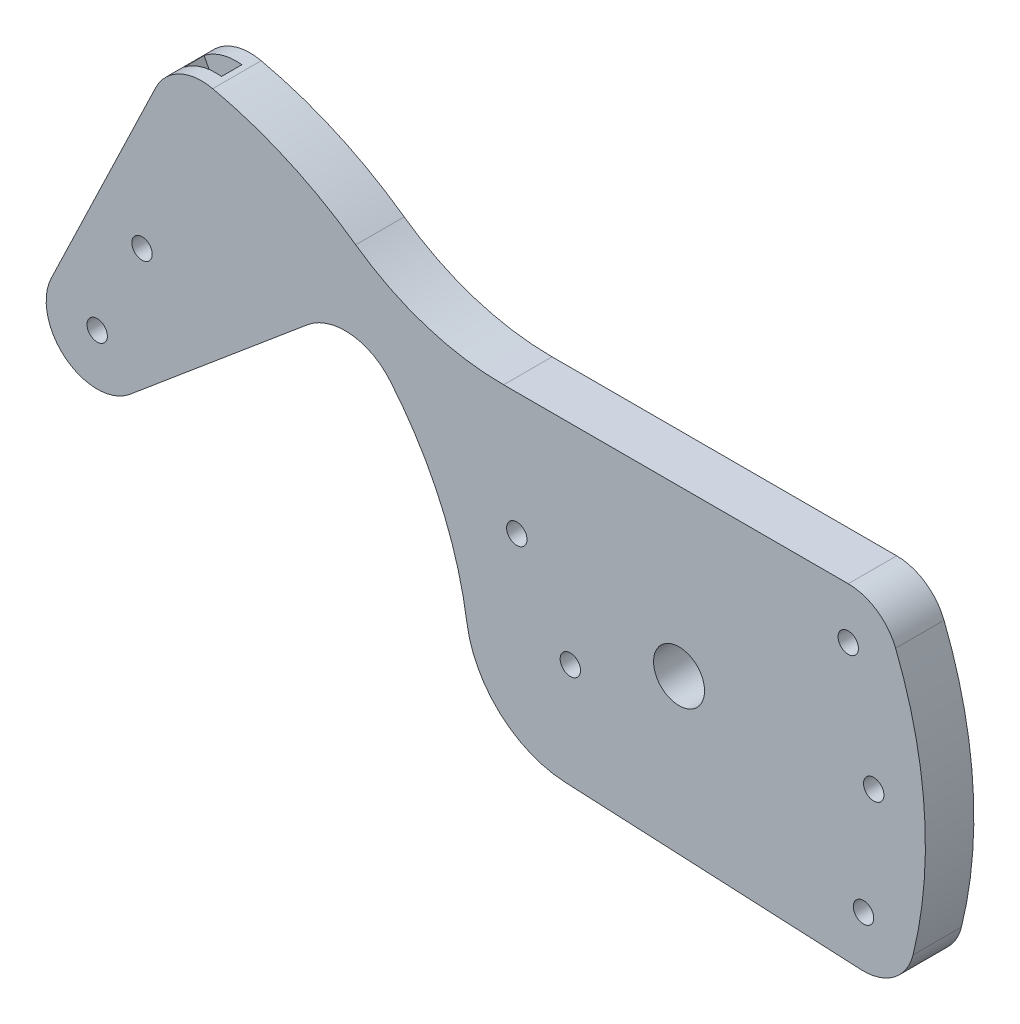
ISO-10303-21;
HEADER;
FILE_DESCRIPTION(('STEP AP214'),'2;1');
FILE_NAME('part.step','',(''),(''),'','','');
FILE_SCHEMA(('AUTOMOTIVE_DESIGN { 1 0 10303 214 1 1 1 1 }'));
ENDSEC;
DATA;
#1=APPLICATION_CONTEXT('core data for automotive mechanical design processes');
#2=APPLICATION_PROTOCOL_DEFINITION('international standard','automotive_design',2000,#1);
#3=PRODUCT_CONTEXT('',#1,'mechanical');
#4=PRODUCT('Part','Part','',(#3));
#5=PRODUCT_RELATED_PRODUCT_CATEGORY('part','',(#4));
#6=PRODUCT_DEFINITION_FORMATION('','',#4);
#7=PRODUCT_DEFINITION_CONTEXT('part definition',#1,'design');
#8=PRODUCT_DEFINITION('design','',#6,#7);
#9=PRODUCT_DEFINITION_SHAPE('','',#8);
#10=(LENGTH_UNIT() NAMED_UNIT(*) SI_UNIT(.MILLI.,.METRE.));
#11=(NAMED_UNIT(*) PLANE_ANGLE_UNIT() SI_UNIT($,.RADIAN.));
#12=(NAMED_UNIT(*) SI_UNIT($,.STERADIAN.) SOLID_ANGLE_UNIT());
#13=UNCERTAINTY_MEASURE_WITH_UNIT(LENGTH_MEASURE(1.E-05),#10,'distance_accuracy_value','');
#14=(GEOMETRIC_REPRESENTATION_CONTEXT(3) GLOBAL_UNCERTAINTY_ASSIGNED_CONTEXT((#13)) GLOBAL_UNIT_ASSIGNED_CONTEXT((#10,
#11,#12)) REPRESENTATION_CONTEXT('',''));
#15=CARTESIAN_POINT('',(0.,0.,0.));
#16=DIRECTION('',(0.,0.,1.));
#17=DIRECTION('',(1.,0.,0.));
#18=AXIS2_PLACEMENT_3D('',#15,#16,#17);
#19=CARTESIAN_POINT('',(-93.6271419122202,44.3112180216615,4.75));
#20=DIRECTION('',(0.,0.,-1.));
#21=DIRECTION('',(-1.,0.,0.));
#22=AXIS2_PLACEMENT_3D('',#19,#20,#21);
#23=CYLINDRICAL_SURFACE('',#22,9.99999999999999);
#24=CARTESIAN_POINT('',(-93.6271419122202,44.3112180216615,-4.75));
#25=DIRECTION('',(0.,0.,1.));
#26=DIRECTION('',(1.,0.,0.));
#27=AXIS2_PLACEMENT_3D('',#24,#25,#26);
#28=CIRCLE('',#27,9.99999999999999);
#29=CARTESIAN_POINT('',(-91.4485216964092,54.0710138164135,-4.75));
#30=VERTEX_POINT('',#29);
#31=CARTESIAN_POINT('',(-102.639296293273,48.6449316038071,-4.75));
#32=VERTEX_POINT('',#31);
#33=EDGE_CURVE('E289',#30,#32,#28,.T.);
#34=ORIENTED_EDGE('',*,*,#33,.T.);
#35=DIRECTION('',(0.,0.,-1.));
#36=VECTOR('',#35,1.);
#37=CARTESIAN_POINT('',(-102.639296293273,48.6449316038071,4.75));
#38=LINE('',#37,#36);
#39=CARTESIAN_POINT('',(-102.639296293273,48.6449316038071,4.75));
#40=VERTEX_POINT('',#39);
#41=EDGE_CURVE('E369',#40,#32,#38,.T.);
#42=ORIENTED_EDGE('',*,*,#41,.F.);
#43=CARTESIAN_POINT('',(-93.6271419122202,44.3112180216615,4.75));
#44=DIRECTION('',(0.,0.,1.));
#45=DIRECTION('',(1.,0.,0.));
#46=AXIS2_PLACEMENT_3D('',#43,#44,#45);
#47=CIRCLE('',#46,9.99999999999999);
#48=CARTESIAN_POINT('',(-91.4485216964092,54.0710138164135,4.75));
#49=VERTEX_POINT('',#48);
#50=EDGE_CURVE('E231',#49,#40,#47,.T.);
#51=ORIENTED_EDGE('',*,*,#50,.F.);
#52=DIRECTION('',(0.,0.,-1.));
#53=VECTOR('',#52,1.);
#54=CARTESIAN_POINT('',(-91.4485216964092,54.0710138164135,4.75));
#55=LINE('',#54,#53);
#56=EDGE_CURVE('E43',#49,#30,#55,.T.);
#57=ORIENTED_EDGE('',*,*,#56,.T.);
#58=EDGE_LOOP('',(#34,#42,#51,#57));
#59=FACE_BOUND('',#58,.T.);
#60=CARTESIAN_POINT('',(-93.6271419122202,44.3112180216615,-2.));
#61=DIRECTION('',(0.,0.,1.));
#62=DIRECTION('',(1.,0.,0.));
#63=AXIS2_PLACEMENT_3D('',#60,#61,#62);
#64=CIRCLE('',#63,10.);
#65=CARTESIAN_POINT('',(-92.4866613894352,54.2459703677016,-2.));
#66=VERTEX_POINT('',#65);
#67=CARTESIAN_POINT('',(-99.8894273287539,52.1076134299171,-2.));
#68=VERTEX_POINT('',#67);
#69=EDGE_CURVE('E189',#66,#68,#64,.T.);
#70=ORIENTED_EDGE('',*,*,#69,.F.);
#71=DIRECTION('',(0.,0.,1.));
#72=VECTOR('',#71,1.);
#73=CARTESIAN_POINT('',(-92.4866613894352,54.2459703677016,-2.));
#74=LINE('',#73,#72);
#75=CARTESIAN_POINT('',(-92.4866613894352,54.2459703677016,2.));
#76=VERTEX_POINT('',#75);
#77=EDGE_CURVE('E172',#66,#76,#74,.T.);
#78=ORIENTED_EDGE('',*,*,#77,.T.);
#79=CARTESIAN_POINT('',(-93.6271419122202,44.3112180216615,2.));
#80=DIRECTION('',(0.,0.,1.));
#81=DIRECTION('',(1.,0.,0.));
#82=AXIS2_PLACEMENT_3D('',#79,#80,#81);
#83=CIRCLE('',#82,10.);
#84=CARTESIAN_POINT('',(-99.8894273287539,52.1076134299171,2.));
#85=VERTEX_POINT('',#84);
#86=EDGE_CURVE('E204',#76,#85,#83,.T.);
#87=ORIENTED_EDGE('',*,*,#86,.T.);
#88=DIRECTION('',(0.,0.,1.));
#89=VECTOR('',#88,1.);
#90=CARTESIAN_POINT('',(-99.8894273287539,52.1076134299171,-2.));
#91=LINE('',#90,#89);
#92=EDGE_CURVE('E182',#68,#85,#91,.T.);
#93=ORIENTED_EDGE('',*,*,#92,.F.);
#94=EDGE_LOOP('',(#70,#78,#87,#93));
#95=FACE_BOUND('',#94,.T.);
#96=ADVANCED_FACE('F35',(#59,#95),#23,.T.);
#97=CARTESIAN_POINT('',(-41.5599291638824,49.5291948890183,4.75));
#98=DIRECTION('',(-0.642787609686535,0.766044443118982,0.));
#99=DIRECTION('',(-0.766044443118982,-0.642787609686535,0.));
#100=AXIS2_PLACEMENT_3D('',#97,#98,#99);
#101=PLANE('',#100);
#102=DIRECTION('',(0.766044443118982,0.642787609686535,0.));
#103=VECTOR('',#102,1.);
#104=CARTESIAN_POINT('',(-41.5599291638824,49.5291948890183,-4.75));
#105=LINE('',#104,#103);
#106=CARTESIAN_POINT('',(-107.689906175498,-5.96044443118984,-4.75));
#107=VERTEX_POINT('',#106);
#108=CARTESIAN_POINT('',(-72.8648183450266,23.2612739230748,-4.75));
#109=VERTEX_POINT('',#108);
#110=EDGE_CURVE('E297',#107,#109,#105,.T.);
#111=ORIENTED_EDGE('',*,*,#110,.T.);
#112=DIRECTION('',(0.,0.,-1.));
#113=VECTOR('',#112,1.);
#114=CARTESIAN_POINT('',(-72.8648183450266,23.2612739230748,4.75));
#115=LINE('',#114,#113);
#116=CARTESIAN_POINT('',(-72.8648183450266,23.2612739230748,4.75));
#117=VERTEX_POINT('',#116);
#118=EDGE_CURVE('E362',#117,#109,#115,.T.);
#119=ORIENTED_EDGE('',*,*,#118,.F.);
#120=DIRECTION('',(0.766044443118982,0.642787609686535,0.));
#121=VECTOR('',#120,1.);
#122=CARTESIAN_POINT('',(-41.5599291638824,49.5291948890183,4.75));
#123=LINE('',#122,#121);
#124=CARTESIAN_POINT('',(-107.689906175498,-5.96044443118984,4.75));
#125=VERTEX_POINT('',#124);
#126=EDGE_CURVE('E238',#125,#117,#123,.T.);
#127=ORIENTED_EDGE('',*,*,#126,.F.);
#128=DIRECTION('',(0.,0.,-1.));
#129=VECTOR('',#128,1.);
#130=CARTESIAN_POINT('',(-107.689906175498,-5.96044443118984,4.75));
#131=LINE('',#130,#129);
#132=EDGE_CURVE('E364',#125,#107,#131,.T.);
#133=ORIENTED_EDGE('',*,*,#132,.T.);
#134=EDGE_LOOP('',(#111,#119,#127,#133));
#135=FACE_BOUND('',#134,.T.);
#136=DIRECTION('',(0.766044443118982,0.642787609686534,0.));
#137=VECTOR('',#136,1.);
#138=CARTESIAN_POINT('',(-41.5599291638823,49.5291948890183,-2.));
#139=LINE('',#138,#137);
#140=CARTESIAN_POINT('',(-92.3690173131185,6.89530776254084,-2.));
#141=VERTEX_POINT('',#140);
#142=CARTESIAN_POINT('',(-78.2271294468595,18.7617606552691,-2.));
#143=VERTEX_POINT('',#142);
#144=EDGE_CURVE('E200',#141,#143,#139,.T.);
#145=ORIENTED_EDGE('',*,*,#144,.F.);
#146=DIRECTION('',(0.,0.,1.));
#147=VECTOR('',#146,1.);
#148=CARTESIAN_POINT('',(-92.3690173131185,6.89530776254084,-2.));
#149=LINE('',#148,#147);
#150=CARTESIAN_POINT('',(-92.3690173131185,6.89530776254084,2.));
#151=VERTEX_POINT('',#150);
#152=EDGE_CURVE('E219',#141,#151,#149,.T.);
#153=ORIENTED_EDGE('',*,*,#152,.T.);
#154=DIRECTION('',(0.766044443118982,0.642787609686534,0.));
#155=VECTOR('',#154,1.);
#156=CARTESIAN_POINT('',(-41.5599291638823,49.5291948890183,2.));
#157=LINE('',#156,#155);
#158=CARTESIAN_POINT('',(-78.2271294468595,18.7617606552691,2.));
#159=VERTEX_POINT('',#158);
#160=EDGE_CURVE('E210',#151,#159,#157,.T.);
#161=ORIENTED_EDGE('',*,*,#160,.T.);
#162=DIRECTION('',(0.,0.,1.));
#163=VECTOR('',#162,1.);
#164=CARTESIAN_POINT('',(-78.2271294468595,18.7617606552691,-2.));
#165=LINE('',#164,#163);
#166=EDGE_CURVE('E217',#143,#159,#165,.T.);
#167=ORIENTED_EDGE('',*,*,#166,.F.);
#168=EDGE_LOOP('',(#145,#153,#161,#167));
#169=FACE_BOUND('',#168,.T.);
#170=ADVANCED_FACE('F434',(#135,#169),#101,.F.);
#171=CARTESIAN_POINT('',(-34.3975290849493,82.3,4.75));
#172=DIRECTION('',(0.,0.,-1.));
#173=DIRECTION('',(-1.,0.,0.));
#174=AXIS2_PLACEMENT_3D('',#171,#172,#173);
#175=CYLINDRICAL_SURFACE('',#174,50.);
#176=CARTESIAN_POINT('',(-34.3975290849493,82.3,-4.75));
#177=DIRECTION('',(0.,0.,1.));
#178=DIRECTION('',(1.,0.,0.));
#179=AXIS2_PLACEMENT_3D('',#176,#177,#178);
#180=CIRCLE('',#179,50.);
#181=CARTESIAN_POINT('',(-63.4015741934302,41.572056676709,-4.75));
#182=VERTEX_POINT('',#181);
#183=CARTESIAN_POINT('',(-34.3975290849493,32.3,-4.75));
#184=VERTEX_POINT('',#183);
#185=EDGE_CURVE('E216',#182,#184,#180,.T.);
#186=ORIENTED_EDGE('',*,*,#185,.F.);
#187=DIRECTION('',(0.,0.,-1.));
#188=VECTOR('',#187,1.);
#189=CARTESIAN_POINT('',(-63.4015741934302,41.572056676709,4.75));
#190=LINE('',#189,#188);
#191=CARTESIAN_POINT('',(-63.4015741934302,41.572056676709,4.75));
#192=VERTEX_POINT('',#191);
#193=EDGE_CURVE('E11',#192,#182,#190,.T.);
#194=ORIENTED_EDGE('',*,*,#193,.F.);
#195=CARTESIAN_POINT('',(-34.3975290849493,82.3,4.75));
#196=DIRECTION('',(0.,0.,1.));
#197=DIRECTION('',(1.,0.,0.));
#198=AXIS2_PLACEMENT_3D('',#195,#196,#197);
#199=CIRCLE('',#198,50.);
#200=CARTESIAN_POINT('',(-34.3975290849493,32.3,4.75));
#201=VERTEX_POINT('',#200);
#202=EDGE_CURVE('E225',#192,#201,#199,.T.);
#203=ORIENTED_EDGE('',*,*,#202,.T.);
#204=DIRECTION('',(0.,0.,-1.));
#205=VECTOR('',#204,1.);
#206=CARTESIAN_POINT('',(-34.3975290849493,32.3,4.75));
#207=LINE('',#206,#205);
#208=EDGE_CURVE('E284',#201,#184,#207,.T.);
#209=ORIENTED_EDGE('',*,*,#208,.T.);
#210=EDGE_LOOP('',(#186,#194,#203,#209));
#211=FACE_BOUND('',#210,.T.);
#212=ADVANCED_FACE('F37',(#211),#175,.F.);
#213=CARTESIAN_POINT('',(-108.317782272363,-21.5,4.75));
#214=DIRECTION('',(0.,0.,-1.));
#215=DIRECTION('',(-1.,0.,0.));
#216=AXIS2_PLACEMENT_3D('',#213,#214,#215);
#217=CYLINDRICAL_SURFACE('',#216,77.4309374967139);
#218=CARTESIAN_POINT('',(-108.317782272363,-21.5,-4.75));
#219=DIRECTION('',(0.,0.,1.));
#220=DIRECTION('',(1.,0.,0.));
#221=AXIS2_PLACEMENT_3D('',#218,#219,#220);
#222=CIRCLE('',#221,77.4309374967139);
#223=EDGE_CURVE('E287',#182,#30,#222,.T.);
#224=ORIENTED_EDGE('',*,*,#223,.T.);
#225=ORIENTED_EDGE('',*,*,#56,.F.);
#226=CARTESIAN_POINT('',(-108.317782272363,-21.5,4.75));
#227=DIRECTION('',(0.,0.,1.));
#228=DIRECTION('',(1.,0.,0.));
#229=AXIS2_PLACEMENT_3D('',#226,#227,#228);
#230=CIRCLE('',#229,77.4309374967139);
#231=EDGE_CURVE('E228',#192,#49,#230,.T.);
#232=ORIENTED_EDGE('',*,*,#231,.F.);
#233=ORIENTED_EDGE('',*,*,#193,.T.);
#234=EDGE_LOOP('',(#224,#225,#232,#233));
#235=FACE_BOUND('',#234,.T.);
#236=ADVANCED_FACE('F396',(#235),#217,.T.);
#237=CARTESIAN_POINT('',(-102.361345817989,49.2229422512733,4.75));
#238=DIRECTION('',(-0.901215438105268,0.433371358214556,0.));
#239=DIRECTION('',(-0.433371358214556,-0.901215438105268,0.));
#240=AXIS2_PLACEMENT_3D('',#237,#238,#239);
#241=PLANE('',#240);
#242=DIRECTION('',(0.433371358214557,0.901215438105268,0.));
#243=VECTOR('',#242,1.);
#244=CARTESIAN_POINT('',(-102.361345817989,49.2229422512733,-4.75));
#245=LINE('',#244,#243);
#246=CARTESIAN_POINT('',(-123.129936653416,6.03371358214555,-4.75));
#247=VERTEX_POINT('',#246);
#248=EDGE_CURVE('E292',#247,#32,#245,.T.);
#249=ORIENTED_EDGE('',*,*,#248,.F.);
#250=DIRECTION('',(0.,0.,-1.));
#251=VECTOR('',#250,1.);
#252=CARTESIAN_POINT('',(-123.129936653416,6.03371358214555,4.75));
#253=LINE('',#252,#251);
#254=CARTESIAN_POINT('',(-123.129936653416,6.03371358214555,4.75));
#255=VERTEX_POINT('',#254);
#256=EDGE_CURVE('E367',#255,#247,#253,.T.);
#257=ORIENTED_EDGE('',*,*,#256,.F.);
#258=DIRECTION('',(0.433371358214557,0.901215438105268,0.));
#259=VECTOR('',#258,1.);
#260=CARTESIAN_POINT('',(-102.361345817989,49.2229422512733,4.75));
#261=LINE('',#260,#259);
#262=EDGE_CURVE('E233',#255,#40,#261,.T.);
#263=ORIENTED_EDGE('',*,*,#262,.T.);
#264=ORIENTED_EDGE('',*,*,#41,.T.);
#265=EDGE_LOOP('',(#249,#257,#263,#264));
#266=FACE_BOUND('',#265,.T.);
#267=ADVANCED_FACE('F387',(#266),#241,.T.);
#268=CARTESIAN_POINT('',(-114.117782272363,1.69999999999999,4.75));
#269=DIRECTION('',(0.,0.,-1.));
#270=DIRECTION('',(-1.,0.,0.));
#271=AXIS2_PLACEMENT_3D('',#268,#269,#270);
#272=CYLINDRICAL_SURFACE('',#271,10.);
#273=CARTESIAN_POINT('',(-114.117782272363,1.69999999999999,-4.75));
#274=DIRECTION('',(0.,0.,1.));
#275=DIRECTION('',(1.,0.,0.));
#276=AXIS2_PLACEMENT_3D('',#273,#274,#275);
#277=CIRCLE('',#276,10.);
#278=EDGE_CURVE('E295',#247,#107,#277,.T.);
#279=ORIENTED_EDGE('',*,*,#278,.T.);
#280=ORIENTED_EDGE('',*,*,#132,.F.);
#281=CARTESIAN_POINT('',(-114.117782272363,1.69999999999999,4.75));
#282=DIRECTION('',(0.,0.,1.));
#283=DIRECTION('',(1.,0.,0.));
#284=AXIS2_PLACEMENT_3D('',#281,#282,#283);
#285=CIRCLE('',#284,10.);
#286=EDGE_CURVE('E236',#255,#125,#285,.T.);
#287=ORIENTED_EDGE('',*,*,#286,.F.);
#288=ORIENTED_EDGE('',*,*,#256,.T.);
#289=EDGE_LOOP('',(#279,#280,#287,#288));
#290=FACE_BOUND('',#289,.T.);
#291=ADVANCED_FACE('F438',(#290),#272,.T.);
#292=CARTESIAN_POINT('',(-65.4725042221845,14.4514570095927,4.75));
#293=DIRECTION('',(0.,0.,-1.));
#294=DIRECTION('',(-1.,0.,0.));
#295=AXIS2_PLACEMENT_3D('',#292,#293,#294);
#296=CYLINDRICAL_SURFACE('',#295,11.5003992165423);
#297=CARTESIAN_POINT('',(-65.4725042221845,14.4514570095927,-4.75));
#298=DIRECTION('',(0.,0.,1.));
#299=DIRECTION('',(1.,0.,0.));
#300=AXIS2_PLACEMENT_3D('',#297,#298,#299);
#301=CIRCLE('',#300,11.5003992165423);
#302=CARTESIAN_POINT('',(-56.6626873087024,21.8437711324349,-4.75));
#303=VERTEX_POINT('',#302);
#304=EDGE_CURVE('E300',#303,#109,#301,.T.);
#305=ORIENTED_EDGE('',*,*,#304,.F.);
#306=DIRECTION('',(0.,0.,-1.));
#307=VECTOR('',#306,1.);
#308=CARTESIAN_POINT('',(-56.6626873087024,21.8437711324349,4.75));
#309=LINE('',#308,#307);
#310=CARTESIAN_POINT('',(-56.6626873087024,21.8437711324349,4.75));
#311=VERTEX_POINT('',#310);
#312=EDGE_CURVE('E360',#311,#303,#309,.T.);
#313=ORIENTED_EDGE('',*,*,#312,.F.);
#314=CARTESIAN_POINT('',(-65.4725042221845,14.4514570095927,4.75));
#315=DIRECTION('',(0.,0.,1.));
#316=DIRECTION('',(1.,0.,0.));
#317=AXIS2_PLACEMENT_3D('',#314,#315,#316);
#318=CIRCLE('',#317,11.5003992165423);
#319=EDGE_CURVE('E240',#311,#117,#318,.T.);
#320=ORIENTED_EDGE('',*,*,#319,.T.);
#321=ORIENTED_EDGE('',*,*,#118,.T.);
#322=EDGE_LOOP('',(#305,#313,#320,#321));
#323=FACE_BOUND('',#322,.T.);
#324=ADVANCED_FACE('F431',(#323),#296,.F.);
#325=CARTESIAN_POINT('',(-108.317782272363,-21.5,4.75));
#326=DIRECTION('',(0.,0.,-1.));
#327=DIRECTION('',(-1.,0.,0.));
#328=AXIS2_PLACEMENT_3D('',#325,#326,#327);
#329=CYLINDRICAL_SURFACE('',#328,67.4309374967139);
#330=CARTESIAN_POINT('',(-108.317782272363,-21.5,-4.75));
#331=DIRECTION('',(0.,0.,1.));
#332=DIRECTION('',(1.,0.,0.));
#333=AXIS2_PLACEMENT_3D('',#330,#331,#332);
#334=CIRCLE('',#333,67.4309374967139);
#335=CARTESIAN_POINT('',(-41.6050176914802,-11.6847886593643,-4.75));
#336=VERTEX_POINT('',#335);
#337=EDGE_CURVE('E303',#336,#303,#334,.T.);
#338=ORIENTED_EDGE('',*,*,#337,.F.);
#339=DIRECTION('',(0.,0.,-1.));
#340=VECTOR('',#339,1.);
#341=CARTESIAN_POINT('',(-41.6050176914802,-11.6847886593643,4.75));
#342=LINE('',#341,#340);
#343=CARTESIAN_POINT('',(-41.6050176914802,-11.6847886593643,4.75));
#344=VERTEX_POINT('',#343);
#345=EDGE_CURVE('E358',#344,#336,#342,.T.);
#346=ORIENTED_EDGE('',*,*,#345,.F.);
#347=CARTESIAN_POINT('',(-108.317782272363,-21.5,4.75));
#348=DIRECTION('',(0.,0.,1.));
#349=DIRECTION('',(1.,0.,0.));
#350=AXIS2_PLACEMENT_3D('',#347,#348,#349);
#351=CIRCLE('',#350,67.4309374967139);
#352=EDGE_CURVE('E243',#344,#311,#351,.T.);
#353=ORIENTED_EDGE('',*,*,#352,.T.);
#354=ORIENTED_EDGE('',*,*,#312,.T.);
#355=EDGE_LOOP('',(#338,#346,#353,#354));
#356=FACE_BOUND('',#355,.T.);
#357=ADVANCED_FACE('F425',(#356),#329,.F.);
#358=CARTESIAN_POINT('',(-21.3177822723635,-8.70000000000001,4.75));
#359=DIRECTION('',(0.,0.,-1.));
#360=DIRECTION('',(-1.,0.,0.));
#361=AXIS2_PLACEMENT_3D('',#358,#359,#360);
#362=CYLINDRICAL_SURFACE('',#361,20.5056305509422);
#363=CARTESIAN_POINT('',(-21.3177822723635,-8.70000000000001,-4.75));
#364=DIRECTION('',(0.,0.,1.));
#365=DIRECTION('',(1.,0.,0.));
#366=AXIS2_PLACEMENT_3D('',#363,#364,#365);
#367=CIRCLE('',#366,20.5056305509422);
#368=CARTESIAN_POINT('',(-22.3087673324672,-29.1816706570142,-4.75));
#369=VERTEX_POINT('',#368);
#370=EDGE_CURVE('E306',#336,#369,#367,.T.);
#371=ORIENTED_EDGE('',*,*,#370,.T.);
#372=DIRECTION('',(0.,0.,-1.));
#373=VECTOR('',#372,1.);
#374=CARTESIAN_POINT('',(-22.3087673324672,-29.1816706570142,4.75));
#375=LINE('',#374,#373);
#376=CARTESIAN_POINT('',(-22.3087673324672,-29.1816706570142,4.75));
#377=VERTEX_POINT('',#376);
#378=EDGE_CURVE('E356',#377,#369,#375,.T.);
#379=ORIENTED_EDGE('',*,*,#378,.F.);
#380=CARTESIAN_POINT('',(-21.3177822723635,-8.70000000000001,4.75));
#381=DIRECTION('',(0.,0.,1.));
#382=DIRECTION('',(1.,0.,0.));
#383=AXIS2_PLACEMENT_3D('',#380,#381,#382);
#384=CIRCLE('',#383,20.5056305509422);
#385=EDGE_CURVE('E246',#344,#377,#384,.T.);
#386=ORIENTED_EDGE('',*,*,#385,.F.);
#387=ORIENTED_EDGE('',*,*,#345,.T.);
#388=EDGE_LOOP('',(#371,#379,#386,#387));
#389=FACE_BOUND('',#388,.T.);
#390=ADVANCED_FACE('F573',(#389),#362,.T.);
#391=CARTESIAN_POINT('',(-1.46073130263893,-30.1903819376533,4.75));
#392=DIRECTION('',(-0.0483274609694089,-0.998831545615301,0.));
#393=DIRECTION('',(0.998831545615301,-0.0483274609694089,0.));
#394=AXIS2_PLACEMENT_3D('',#391,#392,#393);
#395=PLANE('',#394);
#396=DIRECTION('',(-0.998831545615301,0.0483274609694089,0.));
#397=VECTOR('',#396,1.);
#398=CARTESIAN_POINT('',(-1.46073130263893,-30.1903819376533,-4.75));
#399=LINE('',#398,#397);
#400=CARTESIAN_POINT('',(35.6989431179424,-31.988315456153,-4.75));
#401=VERTEX_POINT('',#400);
#402=EDGE_CURVE('E309',#401,#369,#399,.T.);
#403=ORIENTED_EDGE('',*,*,#402,.F.);
#404=DIRECTION('',(0.,0.,-1.));
#405=VECTOR('',#404,1.);
#406=CARTESIAN_POINT('',(35.6989431179424,-31.988315456153,4.75));
#407=LINE('',#406,#405);
#408=CARTESIAN_POINT('',(35.6989431179424,-31.988315456153,4.75));
#409=VERTEX_POINT('',#408);
#410=EDGE_CURVE('E354',#409,#401,#407,.T.);
#411=ORIENTED_EDGE('',*,*,#410,.F.);
#412=DIRECTION('',(-0.998831545615301,0.0483274609694089,0.));
#413=VECTOR('',#412,1.);
#414=CARTESIAN_POINT('',(-1.46073130263893,-30.1903819376533,4.75));
#415=LINE('',#414,#413);
#416=EDGE_CURVE('E248',#409,#377,#415,.T.);
#417=ORIENTED_EDGE('',*,*,#416,.T.);
#418=ORIENTED_EDGE('',*,*,#378,.T.);
#419=EDGE_LOOP('',(#403,#411,#417,#418));
#420=FACE_BOUND('',#419,.T.);
#421=ADVANCED_FACE('F419',(#420),#395,.T.);
#422=CARTESIAN_POINT('',(36.1822177276365,-22.,4.75));
#423=DIRECTION('',(0.,0.,-1.));
#424=DIRECTION('',(-1.,0.,0.));
#425=AXIS2_PLACEMENT_3D('',#422,#423,#424);
#426=CYLINDRICAL_SURFACE('',#425,9.99999999999999);
#427=CARTESIAN_POINT('',(36.1822177276365,-22.,-4.75));
#428=DIRECTION('',(0.,0.,1.));
#429=DIRECTION('',(1.,0.,0.));
#430=AXIS2_PLACEMENT_3D('',#427,#428,#429);
#431=CIRCLE('',#430,9.99999999999999);
#432=CARTESIAN_POINT('',(45.8882570065409,-24.4068239479377,-4.75));
#433=VERTEX_POINT('',#432);
#434=EDGE_CURVE('E312',#401,#433,#431,.T.);
#435=ORIENTED_EDGE('',*,*,#434,.T.);
#436=DIRECTION('',(0.,0.,-1.));
#437=VECTOR('',#436,1.);
#438=CARTESIAN_POINT('',(45.8882570065409,-24.4068239479377,4.75));
#439=LINE('',#438,#437);
#440=CARTESIAN_POINT('',(45.8882570065409,-24.4068239479377,4.75));
#441=VERTEX_POINT('',#440);
#442=EDGE_CURVE('E351',#441,#433,#439,.T.);
#443=ORIENTED_EDGE('',*,*,#442,.F.);
#444=CARTESIAN_POINT('',(36.1822177276365,-22.,4.75));
#445=DIRECTION('',(0.,0.,1.));
#446=DIRECTION('',(1.,0.,0.));
#447=AXIS2_PLACEMENT_3D('',#444,#445,#446);
#448=CIRCLE('',#447,9.99999999999999);
#449=EDGE_CURVE('E251',#409,#441,#448,.T.);
#450=ORIENTED_EDGE('',*,*,#449,.F.);
#451=ORIENTED_EDGE('',*,*,#410,.T.);
#452=EDGE_LOOP('',(#435,#443,#450,#451));
#453=FACE_BOUND('',#452,.T.);
#454=ADVANCED_FACE('F416',(#453),#426,.T.);
#455=CARTESIAN_POINT('',(-34.3029021686694,-4.52167854828258,4.75));
#456=DIRECTION('',(0.,0.,-1.));
#457=DIRECTION('',(-1.,0.,0.));
#458=AXIS2_PLACEMENT_3D('',#455,#456,#457);
#459=CYLINDRICAL_SURFACE('',#458,82.6198584931573);
#460=CARTESIAN_POINT('',(-34.3029021686694,-4.52167854828258,-4.75));
#461=DIRECTION('',(0.,0.,1.));
#462=DIRECTION('',(1.,0.,0.));
#463=AXIS2_PLACEMENT_3D('',#460,#461,#462);
#464=CIRCLE('',#463,82.6198584931573);
#465=CARTESIAN_POINT('',(42.4751468652863,25.9934358045892,-4.75));
#466=VERTEX_POINT('',#465);
#467=EDGE_CURVE('E314',#433,#466,#464,.T.);
#468=ORIENTED_EDGE('',*,*,#467,.T.);
#469=DIRECTION('',(0.,0.,-1.));
#470=VECTOR('',#469,1.);
#471=CARTESIAN_POINT('',(42.4751468652863,25.9934358045892,4.75));
#472=LINE('',#471,#470);
#473=CARTESIAN_POINT('',(42.4751468652863,25.9934358045892,4.75));
#474=VERTEX_POINT('',#473);
#475=EDGE_CURVE('E348',#474,#466,#472,.T.);
#476=ORIENTED_EDGE('',*,*,#475,.F.);
#477=CARTESIAN_POINT('',(-34.3029021686694,-4.52167854828258,4.75));
#478=DIRECTION('',(0.,0.,1.));
#479=DIRECTION('',(1.,0.,0.));
#480=AXIS2_PLACEMENT_3D('',#477,#478,#479);
#481=CIRCLE('',#480,82.6198584931573);
#482=EDGE_CURVE('E253',#441,#474,#481,.T.);
#483=ORIENTED_EDGE('',*,*,#482,.F.);
#484=ORIENTED_EDGE('',*,*,#442,.T.);
#485=EDGE_LOOP('',(#468,#476,#483,#484));
#486=FACE_BOUND('',#485,.T.);
#487=ADVANCED_FACE('F411',(#486),#459,.T.);
#488=CARTESIAN_POINT('',(33.1822177276365,22.3,4.75));
#489=DIRECTION('',(0.,0.,-1.));
#490=DIRECTION('',(-1.,0.,0.));
#491=AXIS2_PLACEMENT_3D('',#488,#489,#490);
#492=CYLINDRICAL_SURFACE('',#491,10.);
#493=CARTESIAN_POINT('',(33.1822177276365,22.3,-4.75));
#494=DIRECTION('',(0.,0.,1.));
#495=DIRECTION('',(1.,0.,0.));
#496=AXIS2_PLACEMENT_3D('',#493,#494,#495);
#497=CIRCLE('',#496,10.);
#498=CARTESIAN_POINT('',(33.1822177276365,32.3,-4.75));
#499=VERTEX_POINT('',#498);
#500=EDGE_CURVE('E316',#466,#499,#497,.T.);
#501=ORIENTED_EDGE('',*,*,#500,.T.);
#502=DIRECTION('',(0.,0.,-1.));
#503=VECTOR('',#502,1.);
#504=CARTESIAN_POINT('',(33.1822177276365,32.3,4.75));
#505=LINE('',#504,#503);
#506=CARTESIAN_POINT('',(33.1822177276365,32.3,4.75));
#507=VERTEX_POINT('',#506);
#508=EDGE_CURVE('E346',#507,#499,#505,.T.);
#509=ORIENTED_EDGE('',*,*,#508,.F.);
#510=CARTESIAN_POINT('',(33.1822177276365,22.3,4.75));
#511=DIRECTION('',(0.,0.,1.));
#512=DIRECTION('',(1.,0.,0.));
#513=AXIS2_PLACEMENT_3D('',#510,#511,#512);
#514=CIRCLE('',#513,10.);
#515=EDGE_CURVE('E255',#474,#507,#514,.T.);
#516=ORIENTED_EDGE('',*,*,#515,.F.);
#517=ORIENTED_EDGE('',*,*,#475,.T.);
#518=EDGE_LOOP('',(#501,#509,#516,#517));
#519=FACE_BOUND('',#518,.T.);
#520=ADVANCED_FACE('F405',(#519),#492,.T.);
#521=CARTESIAN_POINT('',(-105.317782272363,20.,4.75));
#522=DIRECTION('',(0.,0.,-1.));
#523=DIRECTION('',(-1.,0.,0.));
#524=AXIS2_PLACEMENT_3D('',#521,#522,#523);
#525=CYLINDRICAL_SURFACE('',#524,2.);
#526=CARTESIAN_POINT('',(-105.317782272363,20.,4.75));
#527=DIRECTION('',(0.,0.,1.));
#528=DIRECTION('',(1.,0.,0.));
#529=AXIS2_PLACEMENT_3D('',#526,#527,#528);
#530=CIRCLE('',#529,2.);
#531=CARTESIAN_POINT('',(-103.317782272363,20.,4.75));
#532=VERTEX_POINT('',#531);
#533=EDGE_CURVE('E278',#532,#532,#530,.T.);
#534=ORIENTED_EDGE('',*,*,#533,.T.);
#535=EDGE_LOOP('',(#534));
#536=FACE_BOUND('',#535,.T.);
#537=CARTESIAN_POINT('',(-105.317782272363,20.,-4.75));
#538=DIRECTION('',(0.,0.,1.));
#539=DIRECTION('',(1.,0.,0.));
#540=AXIS2_PLACEMENT_3D('',#537,#538,#539);
#541=CIRCLE('',#540,2.);
#542=CARTESIAN_POINT('',(-103.317782272363,20.,-4.75));
#543=VERTEX_POINT('',#542);
#544=EDGE_CURVE('E340',#543,#543,#541,.T.);
#545=ORIENTED_EDGE('',*,*,#544,.F.);
#546=EDGE_LOOP('',(#545));
#547=FACE_BOUND('',#546,.T.);
#548=ADVANCED_FACE('F535',(#536,#547),#525,.F.);
#549=CARTESIAN_POINT('',(0.,0.,4.75));
#550=DIRECTION('',(0.,0.,-1.));
#551=DIRECTION('',(-1.,0.,0.));
#552=AXIS2_PLACEMENT_3D('',#549,#550,#551);
#553=CYLINDRICAL_SURFACE('',#552,5.);
#554=CARTESIAN_POINT('',(0.,0.,4.75));
#555=DIRECTION('',(0.,0.,1.));
#556=DIRECTION('',(1.,0.,0.));
#557=AXIS2_PLACEMENT_3D('',#554,#555,#556);
#558=CIRCLE('',#557,5.);
#559=CARTESIAN_POINT('',(5.,0.,4.75));
#560=VERTEX_POINT('',#559);
#561=EDGE_CURVE('E275',#560,#560,#558,.T.);
#562=ORIENTED_EDGE('',*,*,#561,.T.);
#563=EDGE_LOOP('',(#562));
#564=FACE_BOUND('',#563,.T.);
#565=CARTESIAN_POINT('',(0.,0.,-4.75));
#566=DIRECTION('',(0.,0.,1.));
#567=DIRECTION('',(1.,0.,0.));
#568=AXIS2_PLACEMENT_3D('',#565,#566,#567);
#569=CIRCLE('',#568,5.);
#570=CARTESIAN_POINT('',(5.,0.,-4.75));
#571=VERTEX_POINT('',#570);
#572=EDGE_CURVE('E337',#571,#571,#569,.T.);
#573=ORIENTED_EDGE('',*,*,#572,.F.);
#574=EDGE_LOOP('',(#573));
#575=FACE_BOUND('',#574,.T.);
#576=ADVANCED_FACE('F538',(#564,#575),#553,.F.);
#577=CARTESIAN_POINT('',(-31.8177822723635,8.3,4.75));
#578=DIRECTION('',(0.,0.,-1.));
#579=DIRECTION('',(-1.,0.,0.));
#580=AXIS2_PLACEMENT_3D('',#577,#578,#579);
#581=CYLINDRICAL_SURFACE('',#580,2.);
#582=CARTESIAN_POINT('',(-31.8177822723635,8.3,4.75));
#583=DIRECTION('',(0.,0.,1.));
#584=DIRECTION('',(1.,0.,0.));
#585=AXIS2_PLACEMENT_3D('',#582,#583,#584);
#586=CIRCLE('',#585,2.);
#587=CARTESIAN_POINT('',(-29.8177822723635,8.3,4.75));
#588=VERTEX_POINT('',#587);
#589=EDGE_CURVE('E272',#588,#588,#586,.T.);
#590=ORIENTED_EDGE('',*,*,#589,.T.);
#591=EDGE_LOOP('',(#590));
#592=FACE_BOUND('',#591,.T.);
#593=CARTESIAN_POINT('',(-31.8177822723635,8.3,-4.75));
#594=DIRECTION('',(0.,0.,1.));
#595=DIRECTION('',(1.,0.,0.));
#596=AXIS2_PLACEMENT_3D('',#593,#594,#595);
#597=CIRCLE('',#596,2.);
#598=CARTESIAN_POINT('',(-29.8177822723635,8.3,-4.75));
#599=VERTEX_POINT('',#598);
#600=EDGE_CURVE('E334',#599,#599,#597,.T.);
#601=ORIENTED_EDGE('',*,*,#600,.F.);
#602=EDGE_LOOP('',(#601));
#603=FACE_BOUND('',#602,.T.);
#604=ADVANCED_FACE('F542',(#592,#603),#581,.F.);
#605=CARTESIAN_POINT('',(-21.3177822723635,-8.70000000000001,4.75));
#606=DIRECTION('',(0.,0.,-1.));
#607=DIRECTION('',(-1.,0.,0.));
#608=AXIS2_PLACEMENT_3D('',#605,#606,#607);
#609=CYLINDRICAL_SURFACE('',#608,2.00000000000001);
#610=CARTESIAN_POINT('',(-21.3177822723635,-8.70000000000001,4.75));
#611=DIRECTION('',(0.,0.,1.));
#612=DIRECTION('',(1.,0.,0.));
#613=AXIS2_PLACEMENT_3D('',#610,#611,#612);
#614=CIRCLE('',#613,2.00000000000001);
#615=CARTESIAN_POINT('',(-19.3177822723634,-8.70000000000001,4.75));
#616=VERTEX_POINT('',#615);
#617=EDGE_CURVE('E269',#616,#616,#614,.T.);
#618=ORIENTED_EDGE('',*,*,#617,.T.);
#619=EDGE_LOOP('',(#618));
#620=FACE_BOUND('',#619,.T.);
#621=CARTESIAN_POINT('',(-21.3177822723635,-8.70000000000001,-4.75));
#622=DIRECTION('',(0.,0.,1.));
#623=DIRECTION('',(1.,0.,0.));
#624=AXIS2_PLACEMENT_3D('',#621,#622,#623);
#625=CIRCLE('',#624,2.00000000000001);
#626=CARTESIAN_POINT('',(-19.3177822723634,-8.70000000000001,-4.75));
#627=VERTEX_POINT('',#626);
#628=EDGE_CURVE('E331',#627,#627,#625,.T.);
#629=ORIENTED_EDGE('',*,*,#628,.F.);
#630=EDGE_LOOP('',(#629));
#631=FACE_BOUND('',#630,.T.);
#632=ADVANCED_FACE('F546',(#620,#631),#609,.F.);
#633=CARTESIAN_POINT('',(33.1822177276365,22.3,4.75));
#634=DIRECTION('',(0.,0.,-1.));
#635=DIRECTION('',(-1.,0.,0.));
#636=AXIS2_PLACEMENT_3D('',#633,#634,#635);
#637=CYLINDRICAL_SURFACE('',#636,2.);
#638=CARTESIAN_POINT('',(33.1822177276365,22.3,4.75));
#639=DIRECTION('',(0.,0.,1.));
#640=DIRECTION('',(1.,0.,0.));
#641=AXIS2_PLACEMENT_3D('',#638,#639,#640);
#642=CIRCLE('',#641,2.);
#643=CARTESIAN_POINT('',(35.1822177276365,22.3,4.75));
#644=VERTEX_POINT('',#643);
#645=EDGE_CURVE('E266',#644,#644,#642,.T.);
#646=ORIENTED_EDGE('',*,*,#645,.T.);
#647=EDGE_LOOP('',(#646));
#648=FACE_BOUND('',#647,.T.);
#649=CARTESIAN_POINT('',(33.1822177276365,22.3,-4.75));
#650=DIRECTION('',(0.,0.,1.));
#651=DIRECTION('',(1.,0.,0.));
#652=AXIS2_PLACEMENT_3D('',#649,#650,#651);
#653=CIRCLE('',#652,2.);
#654=CARTESIAN_POINT('',(35.1822177276365,22.3,-4.75));
#655=VERTEX_POINT('',#654);
#656=EDGE_CURVE('E328',#655,#655,#653,.T.);
#657=ORIENTED_EDGE('',*,*,#656,.F.);
#658=EDGE_LOOP('',(#657));
#659=FACE_BOUND('',#658,.T.);
#660=ADVANCED_FACE('F550',(#648,#659),#637,.F.);
#661=CARTESIAN_POINT('',(38.1822177276366,-0.100000000000012,4.75));
#662=DIRECTION('',(0.,0.,-1.));
#663=DIRECTION('',(-1.,0.,0.));
#664=AXIS2_PLACEMENT_3D('',#661,#662,#663);
#665=CYLINDRICAL_SURFACE('',#664,2.);
#666=CARTESIAN_POINT('',(38.1822177276366,-0.100000000000012,4.75));
#667=DIRECTION('',(0.,0.,1.));
#668=DIRECTION('',(1.,0.,0.));
#669=AXIS2_PLACEMENT_3D('',#666,#667,#668);
#670=CIRCLE('',#669,2.);
#671=CARTESIAN_POINT('',(40.1822177276366,-0.100000000000012,4.75));
#672=VERTEX_POINT('',#671);
#673=EDGE_CURVE('E263',#672,#672,#670,.T.);
#674=ORIENTED_EDGE('',*,*,#673,.T.);
#675=EDGE_LOOP('',(#674));
#676=FACE_BOUND('',#675,.T.);
#677=CARTESIAN_POINT('',(38.1822177276366,-0.100000000000012,-4.75));
#678=DIRECTION('',(0.,0.,1.));
#679=DIRECTION('',(1.,0.,0.));
#680=AXIS2_PLACEMENT_3D('',#677,#678,#679);
#681=CIRCLE('',#680,2.);
#682=CARTESIAN_POINT('',(40.1822177276366,-0.100000000000012,-4.75));
#683=VERTEX_POINT('',#682);
#684=EDGE_CURVE('E325',#683,#683,#681,.T.);
#685=ORIENTED_EDGE('',*,*,#684,.F.);
#686=EDGE_LOOP('',(#685));
#687=FACE_BOUND('',#686,.T.);
#688=ADVANCED_FACE('F554',(#676,#687),#665,.F.);
#689=CARTESIAN_POINT('',(36.1822177276365,-22.,4.75));
#690=DIRECTION('',(0.,0.,-1.));
#691=DIRECTION('',(-1.,0.,0.));
#692=AXIS2_PLACEMENT_3D('',#689,#690,#691);
#693=CYLINDRICAL_SURFACE('',#692,2.);
#694=CARTESIAN_POINT('',(36.1822177276365,-22.,4.75));
#695=DIRECTION('',(0.,0.,1.));
#696=DIRECTION('',(1.,0.,0.));
#697=AXIS2_PLACEMENT_3D('',#694,#695,#696);
#698=CIRCLE('',#697,2.);
#699=CARTESIAN_POINT('',(38.1822177276366,-22.,4.75));
#700=VERTEX_POINT('',#699);
#701=EDGE_CURVE('E260',#700,#700,#698,.T.);
#702=ORIENTED_EDGE('',*,*,#701,.T.);
#703=EDGE_LOOP('',(#702));
#704=FACE_BOUND('',#703,.T.);
#705=CARTESIAN_POINT('',(36.1822177276365,-22.,-4.75));
#706=DIRECTION('',(0.,0.,1.));
#707=DIRECTION('',(1.,0.,0.));
#708=AXIS2_PLACEMENT_3D('',#705,#706,#707);
#709=CIRCLE('',#708,2.);
#710=CARTESIAN_POINT('',(38.1822177276366,-22.,-4.75));
#711=VERTEX_POINT('',#710);
#712=EDGE_CURVE('E322',#711,#711,#709,.T.);
#713=ORIENTED_EDGE('',*,*,#712,.F.);
#714=EDGE_LOOP('',(#713));
#715=FACE_BOUND('',#714,.T.);
#716=ADVANCED_FACE('F558',(#704,#715),#693,.F.);
#717=CARTESIAN_POINT('',(0.,32.3,4.75));
#718=DIRECTION('',(0.,1.,0.));
#719=DIRECTION('',(-1.,0.,0.));
#720=AXIS2_PLACEMENT_3D('',#717,#718,#719);
#721=PLANE('',#720);
#722=DIRECTION('',(1.,0.,0.));
#723=VECTOR('',#722,1.);
#724=CARTESIAN_POINT('',(0.,32.3,-4.75));
#725=LINE('',#724,#723);
#726=EDGE_CURVE('E319',#184,#499,#725,.T.);
#727=ORIENTED_EDGE('',*,*,#726,.F.);
#728=ORIENTED_EDGE('',*,*,#208,.F.);
#729=DIRECTION('',(1.,0.,0.));
#730=VECTOR('',#729,1.);
#731=CARTESIAN_POINT('',(0.,32.3,4.75));
#732=LINE('',#731,#730);
#733=EDGE_CURVE('E257',#201,#507,#732,.T.);
#734=ORIENTED_EDGE('',*,*,#733,.T.);
#735=ORIENTED_EDGE('',*,*,#508,.T.);
#736=EDGE_LOOP('',(#727,#728,#734,#735));
#737=FACE_BOUND('',#736,.T.);
#738=ADVANCED_FACE('F401',(#737),#721,.T.);
#739=CARTESIAN_POINT('',(-114.117782272363,1.69999999999999,4.75));
#740=DIRECTION('',(0.,0.,-1.));
#741=DIRECTION('',(-1.,0.,0.));
#742=AXIS2_PLACEMENT_3D('',#739,#740,#741);
#743=CYLINDRICAL_SURFACE('',#742,2.);
#744=CARTESIAN_POINT('',(-114.117782272363,1.69999999999999,4.75));
#745=DIRECTION('',(0.,0.,1.));
#746=DIRECTION('',(1.,0.,0.));
#747=AXIS2_PLACEMENT_3D('',#744,#745,#746);
#748=CIRCLE('',#747,2.);
#749=CARTESIAN_POINT('',(-112.117782272363,1.69999999999999,4.75));
#750=VERTEX_POINT('',#749);
#751=EDGE_CURVE('E281',#750,#750,#748,.T.);
#752=ORIENTED_EDGE('',*,*,#751,.T.);
#753=EDGE_LOOP('',(#752));
#754=FACE_BOUND('',#753,.T.);
#755=CARTESIAN_POINT('',(-114.117782272363,1.69999999999999,-4.75));
#756=DIRECTION('',(0.,0.,1.));
#757=DIRECTION('',(1.,0.,0.));
#758=AXIS2_PLACEMENT_3D('',#755,#756,#757);
#759=CIRCLE('',#758,2.);
#760=CARTESIAN_POINT('',(-112.117782272363,1.69999999999999,-4.75));
#761=VERTEX_POINT('',#760);
#762=EDGE_CURVE('E229',#761,#761,#759,.T.);
#763=ORIENTED_EDGE('',*,*,#762,.F.);
#764=EDGE_LOOP('',(#763));
#765=FACE_BOUND('',#764,.T.);
#766=ADVANCED_FACE('F530',(#754,#765),#743,.F.);
#767=CARTESIAN_POINT('',(0.,0.,4.75));
#768=DIRECTION('',(0.,0.,1.));
#769=DIRECTION('',(1.,0.,0.));
#770=AXIS2_PLACEMENT_3D('',#767,#768,#769);
#771=PLANE('',#770);
#772=ORIENTED_EDGE('',*,*,#202,.F.);
#773=ORIENTED_EDGE('',*,*,#231,.T.);
#774=ORIENTED_EDGE('',*,*,#50,.T.);
#775=ORIENTED_EDGE('',*,*,#262,.F.);
#776=ORIENTED_EDGE('',*,*,#286,.T.);
#777=ORIENTED_EDGE('',*,*,#126,.T.);
#778=ORIENTED_EDGE('',*,*,#319,.F.);
#779=ORIENTED_EDGE('',*,*,#352,.F.);
#780=ORIENTED_EDGE('',*,*,#385,.T.);
#781=ORIENTED_EDGE('',*,*,#416,.F.);
#782=ORIENTED_EDGE('',*,*,#449,.T.);
#783=ORIENTED_EDGE('',*,*,#482,.T.);
#784=ORIENTED_EDGE('',*,*,#515,.T.);
#785=ORIENTED_EDGE('',*,*,#733,.F.);
#786=EDGE_LOOP('',(#772,#773,#774,#775,#776,#777,#778,#779,#780,#781,#782,#783,#784,#785));
#787=FACE_BOUND('',#786,.T.);
#788=ORIENTED_EDGE('',*,*,#701,.F.);
#789=EDGE_LOOP('',(#788));
#790=FACE_BOUND('',#789,.T.);
#791=ORIENTED_EDGE('',*,*,#673,.F.);
#792=EDGE_LOOP('',(#791));
#793=FACE_BOUND('',#792,.T.);
#794=ORIENTED_EDGE('',*,*,#645,.F.);
#795=EDGE_LOOP('',(#794));
#796=FACE_BOUND('',#795,.T.);
#797=ORIENTED_EDGE('',*,*,#617,.F.);
#798=EDGE_LOOP('',(#797));
#799=FACE_BOUND('',#798,.T.);
#800=ORIENTED_EDGE('',*,*,#589,.F.);
#801=EDGE_LOOP('',(#800));
#802=FACE_BOUND('',#801,.T.);
#803=ORIENTED_EDGE('',*,*,#561,.F.);
#804=EDGE_LOOP('',(#803));
#805=FACE_BOUND('',#804,.T.);
#806=ORIENTED_EDGE('',*,*,#533,.F.);
#807=EDGE_LOOP('',(#806));
#808=FACE_BOUND('',#807,.T.);
#809=ORIENTED_EDGE('',*,*,#751,.F.);
#810=EDGE_LOOP('',(#809));
#811=FACE_BOUND('',#810,.T.);
#812=ADVANCED_FACE('F392',(#787,#790,#793,#796,#799,#802,#805,#808,#811),#771,.T.);
#813=CARTESIAN_POINT('',(0.,0.,-4.75));
#814=DIRECTION('',(0.,0.,1.));
#815=DIRECTION('',(1.,0.,0.));
#816=AXIS2_PLACEMENT_3D('',#813,#814,#815);
#817=PLANE('',#816);
#818=ORIENTED_EDGE('',*,*,#185,.T.);
#819=ORIENTED_EDGE('',*,*,#726,.T.);
#820=ORIENTED_EDGE('',*,*,#500,.F.);
#821=ORIENTED_EDGE('',*,*,#467,.F.);
#822=ORIENTED_EDGE('',*,*,#434,.F.);
#823=ORIENTED_EDGE('',*,*,#402,.T.);
#824=ORIENTED_EDGE('',*,*,#370,.F.);
#825=ORIENTED_EDGE('',*,*,#337,.T.);
#826=ORIENTED_EDGE('',*,*,#304,.T.);
#827=ORIENTED_EDGE('',*,*,#110,.F.);
#828=ORIENTED_EDGE('',*,*,#278,.F.);
#829=ORIENTED_EDGE('',*,*,#248,.T.);
#830=ORIENTED_EDGE('',*,*,#33,.F.);
#831=ORIENTED_EDGE('',*,*,#223,.F.);
#832=EDGE_LOOP('',(#818,#819,#820,#821,#822,#823,#824,#825,#826,#827,#828,#829,#830,#831));
#833=FACE_BOUND('',#832,.T.);
#834=ORIENTED_EDGE('',*,*,#712,.T.);
#835=EDGE_LOOP('',(#834));
#836=FACE_BOUND('',#835,.T.);
#837=ORIENTED_EDGE('',*,*,#684,.T.);
#838=EDGE_LOOP('',(#837));
#839=FACE_BOUND('',#838,.T.);
#840=ORIENTED_EDGE('',*,*,#656,.T.);
#841=EDGE_LOOP('',(#840));
#842=FACE_BOUND('',#841,.T.);
#843=ORIENTED_EDGE('',*,*,#628,.T.);
#844=EDGE_LOOP('',(#843));
#845=FACE_BOUND('',#844,.T.);
#846=ORIENTED_EDGE('',*,*,#600,.T.);
#847=EDGE_LOOP('',(#846));
#848=FACE_BOUND('',#847,.T.);
#849=ORIENTED_EDGE('',*,*,#572,.T.);
#850=EDGE_LOOP('',(#849));
#851=FACE_BOUND('',#850,.T.);
#852=ORIENTED_EDGE('',*,*,#544,.T.);
#853=EDGE_LOOP('',(#852));
#854=FACE_BOUND('',#853,.T.);
#855=ORIENTED_EDGE('',*,*,#762,.T.);
#856=EDGE_LOOP('',(#855));
#857=FACE_BOUND('',#856,.T.);
#858=ADVANCED_FACE('F380',(#833,#836,#839,#842,#845,#848,#851,#854,#857),#817,.F.);
#859=CARTESIAN_POINT('',(-87.0885247759932,-7.60124381388701,-2.));
#860=DIRECTION('',(-0.996212569204348,-0.086951233224569,0.));
#861=DIRECTION('',(0.086951233224569,-0.996212569204348,0.));
#862=AXIS2_PLACEMENT_3D('',#859,#860,#861);
#863=PLANE('',#862);
#864=DIRECTION('',(0.086951233224569,-0.996212569204347,0.));
#865=VECTOR('',#864,1.);
#866=CARTESIAN_POINT('',(-87.0885247759932,-7.60124381388701,2.));
#867=LINE('',#866,#865);
#868=CARTESIAN_POINT('',(-91.6689095047454,44.8768714394033,2.));
#869=VERTEX_POINT('',#868);
#870=EDGE_CURVE('E178',#76,#869,#867,.T.);
#871=ORIENTED_EDGE('',*,*,#870,.F.);
#872=ORIENTED_EDGE('',*,*,#77,.F.);
#873=DIRECTION('',(0.086951233224569,-0.996212569204347,0.));
#874=VECTOR('',#873,1.);
#875=CARTESIAN_POINT('',(-87.0885247759932,-7.60124381388701,-2.));
#876=LINE('',#875,#874);
#877=CARTESIAN_POINT('',(-91.6689095047454,44.8768714394033,-2.));
#878=VERTEX_POINT('',#877);
#879=EDGE_CURVE('E176',#66,#878,#876,.T.);
#880=ORIENTED_EDGE('',*,*,#879,.T.);
#881=DIRECTION('',(0.,0.,1.));
#882=VECTOR('',#881,1.);
#883=CARTESIAN_POINT('',(-91.6689095047454,44.8768714394033,-2.));
#884=LINE('',#883,#882);
#885=EDGE_CURVE('E214',#878,#869,#884,.T.);
#886=ORIENTED_EDGE('',*,*,#885,.T.);
#887=EDGE_LOOP('',(#871,#872,#880,#886));
#888=FACE_BOUND('',#887,.T.);
#889=ADVANCED_FACE('F174',(#888),#863,.T.);
#890=CARTESIAN_POINT('',(-54.2087355087974,-27.9019264344094,-2.));
#891=DIRECTION('',(-0.889133331658835,-0.457648247602087,0.));
#892=DIRECTION('',(0.457648247602087,-0.889133331658835,0.));
#893=AXIS2_PLACEMENT_3D('',#890,#891,#892);
#894=PLANE('',#893);
#895=DIRECTION('',(0.457648247602087,-0.889133331658835,0.));
#896=VECTOR('',#895,1.);
#897=CARTESIAN_POINT('',(-54.2087355087974,-27.9019264344094,2.));
#898=LINE('',#897,#896);
#899=EDGE_CURVE('E57',#869,#159,#898,.T.);
#900=ORIENTED_EDGE('',*,*,#899,.F.);
#901=ORIENTED_EDGE('',*,*,#885,.F.);
#902=DIRECTION('',(0.457648247602087,-0.889133331658835,0.));
#903=VECTOR('',#902,1.);
#904=CARTESIAN_POINT('',(-54.2087355087974,-27.9019264344094,-2.));
#905=LINE('',#904,#903);
#906=EDGE_CURVE('E183',#878,#143,#905,.T.);
#907=ORIENTED_EDGE('',*,*,#906,.T.);
#908=ORIENTED_EDGE('',*,*,#166,.T.);
#909=EDGE_LOOP('',(#900,#901,#907,#908));
#910=FACE_BOUND('',#909,.T.);
#911=ADVANCED_FACE('F476',(#910),#894,.T.);
#912=CARTESIAN_POINT('',(-91.0733750528106,-7.94904874678517,-2.));
#913=DIRECTION('',(-0.996212569204348,-0.0869512332245675,0.));
#914=DIRECTION('',(0.0869512332245675,-0.996212569204348,0.));
#915=AXIS2_PLACEMENT_3D('',#912,#913,#914);
#916=PLANE('',#915);
#917=DIRECTION('',(0.0869512332245676,-0.996212569204348,0.));
#918=VECTOR('',#917,1.);
#919=CARTESIAN_POINT('',(-91.0733750528106,-7.94904874678517,2.));
#920=LINE('',#919,#918);
#921=CARTESIAN_POINT('',(-95.585374319695,43.7455646039198,2.));
#922=VERTEX_POINT('',#921);
#923=EDGE_CURVE('E207',#922,#151,#920,.T.);
#924=ORIENTED_EDGE('',*,*,#923,.T.);
#925=ORIENTED_EDGE('',*,*,#152,.F.);
#926=DIRECTION('',(0.0869512332245676,-0.996212569204348,0.));
#927=VECTOR('',#926,1.);
#928=CARTESIAN_POINT('',(-91.0733750528106,-7.94904874678517,-2.));
#929=LINE('',#928,#927);
#930=CARTESIAN_POINT('',(-95.585374319695,43.7455646039198,-2.));
#931=VERTEX_POINT('',#930);
#932=EDGE_CURVE('E195',#931,#141,#929,.T.);
#933=ORIENTED_EDGE('',*,*,#932,.F.);
#934=DIRECTION('',(0.,0.,1.));
#935=VECTOR('',#934,1.);
#936=CARTESIAN_POINT('',(-95.585374319695,43.7455646039198,-2.));
#937=LINE('',#936,#935);
#938=EDGE_CURVE('E222',#931,#922,#937,.T.);
#939=ORIENTED_EDGE('',*,*,#938,.T.);
#940=EDGE_LOOP('',(#924,#925,#933,#939));
#941=FACE_BOUND('',#940,.T.);
#942=ADVANCED_FACE('F486',(#941),#916,.F.);
#943=CARTESIAN_POINT('',(-57.7652688354326,-29.7325194248178,-2.));
#944=DIRECTION('',(-0.889133331658834,-0.457648247602088,0.));
#945=DIRECTION('',(0.457648247602088,-0.889133331658834,0.));
#946=AXIS2_PLACEMENT_3D('',#943,#944,#945);
#947=PLANE('',#946);
#948=DIRECTION('',(0.457648247602088,-0.889133331658834,0.));
#949=VECTOR('',#948,1.);
#950=CARTESIAN_POINT('',(-57.7652688354326,-29.7325194248178,2.));
#951=LINE('',#950,#949);
#952=EDGE_CURVE('E50',#85,#922,#951,.T.);
#953=ORIENTED_EDGE('',*,*,#952,.T.);
#954=ORIENTED_EDGE('',*,*,#938,.F.);
#955=DIRECTION('',(0.457648247602088,-0.889133331658834,0.));
#956=VECTOR('',#955,1.);
#957=CARTESIAN_POINT('',(-57.7652688354326,-29.7325194248178,-2.));
#958=LINE('',#957,#956);
#959=EDGE_CURVE('E193',#68,#931,#958,.T.);
#960=ORIENTED_EDGE('',*,*,#959,.F.);
#961=ORIENTED_EDGE('',*,*,#92,.T.);
#962=EDGE_LOOP('',(#953,#954,#960,#961));
#963=FACE_BOUND('',#962,.T.);
#964=ADVANCED_FACE('F496',(#963),#947,.F.);
#965=CARTESIAN_POINT('',(0.,0.,-2.));
#966=DIRECTION('',(0.,0.,1.));
#967=DIRECTION('',(1.,0.,0.));
#968=AXIS2_PLACEMENT_3D('',#965,#966,#967);
#969=PLANE('',#968);
#970=ORIENTED_EDGE('',*,*,#879,.F.);
#971=ORIENTED_EDGE('',*,*,#69,.T.);
#972=ORIENTED_EDGE('',*,*,#959,.T.);
#973=ORIENTED_EDGE('',*,*,#932,.T.);
#974=ORIENTED_EDGE('',*,*,#144,.T.);
#975=ORIENTED_EDGE('',*,*,#906,.F.);
#976=EDGE_LOOP('',(#970,#971,#972,#973,#974,#975));
#977=FACE_BOUND('',#976,.T.);
#978=ADVANCED_FACE('F187',(#977),#969,.T.);
#979=CARTESIAN_POINT('',(0.,0.,2.));
#980=DIRECTION('',(0.,0.,1.));
#981=DIRECTION('',(1.,0.,0.));
#982=AXIS2_PLACEMENT_3D('',#979,#980,#981);
#983=PLANE('',#982);
#984=ORIENTED_EDGE('',*,*,#870,.T.);
#985=ORIENTED_EDGE('',*,*,#899,.T.);
#986=ORIENTED_EDGE('',*,*,#160,.F.);
#987=ORIENTED_EDGE('',*,*,#923,.F.);
#988=ORIENTED_EDGE('',*,*,#952,.F.);
#989=ORIENTED_EDGE('',*,*,#86,.F.);
#990=EDGE_LOOP('',(#984,#985,#986,#987,#988,#989));
#991=FACE_BOUND('',#990,.T.);
#992=ADVANCED_FACE('F515',(#991),#983,.F.);
#993=CLOSED_SHELL('',(#96,#170,#212,#236,#267,#291,#324,#357,#390,#421,#454,#487,#520,#548,#576,
#604,#632,#660,#688,#716,#738,#766,#812,#858,#889,#911,#942,#964,#978,#992));
#994=MANIFOLD_SOLID_BREP('B2',#993);
#995=ADVANCED_BREP_SHAPE_REPRESENTATION('',(#18,#994),#14);
#996=SHAPE_DEFINITION_REPRESENTATION(#9,#995);
ENDSEC;
END-ISO-10303-21;
